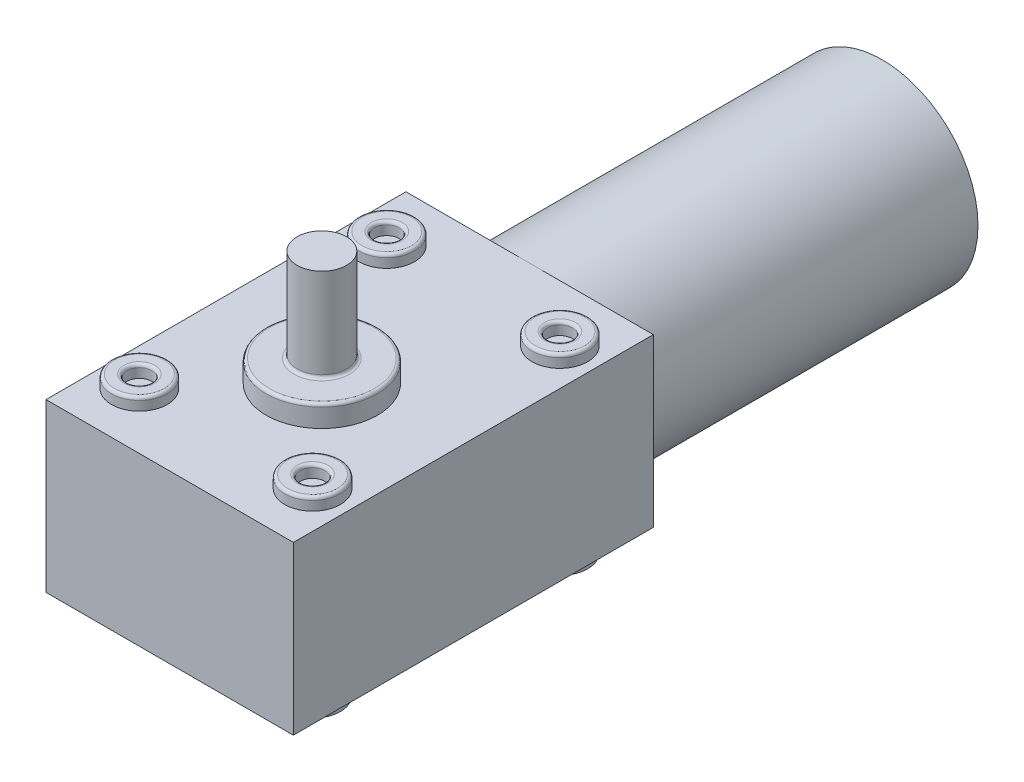
ISO-10303-21;
HEADER;
FILE_DESCRIPTION(('STEP AP214'),'2;1');
FILE_NAME('part.step','',(''),(''),'','','');
FILE_SCHEMA(('AUTOMOTIVE_DESIGN { 1 0 10303 214 1 1 1 1 }'));
ENDSEC;
DATA;
#1=APPLICATION_CONTEXT('core data for automotive mechanical design processes');
#2=APPLICATION_PROTOCOL_DEFINITION('international standard','automotive_design',2000,#1);
#3=PRODUCT_CONTEXT('',#1,'mechanical');
#4=PRODUCT('Part','Part','',(#3));
#5=PRODUCT_RELATED_PRODUCT_CATEGORY('part','',(#4));
#6=PRODUCT_DEFINITION_FORMATION('','',#4);
#7=PRODUCT_DEFINITION_CONTEXT('part definition',#1,'design');
#8=PRODUCT_DEFINITION('design','',#6,#7);
#9=PRODUCT_DEFINITION_SHAPE('','',#8);
#10=(LENGTH_UNIT() NAMED_UNIT(*) SI_UNIT(.MILLI.,.METRE.));
#11=(NAMED_UNIT(*) PLANE_ANGLE_UNIT() SI_UNIT($,.RADIAN.));
#12=(NAMED_UNIT(*) SI_UNIT($,.STERADIAN.) SOLID_ANGLE_UNIT());
#13=UNCERTAINTY_MEASURE_WITH_UNIT(LENGTH_MEASURE(1.E-05),#10,'distance_accuracy_value','');
#14=(GEOMETRIC_REPRESENTATION_CONTEXT(3) GLOBAL_UNCERTAINTY_ASSIGNED_CONTEXT((#13)) GLOBAL_UNIT_ASSIGNED_CONTEXT((#10,
#11,#12)) REPRESENTATION_CONTEXT('',''));
#15=CARTESIAN_POINT('',(0.,0.,0.));
#16=DIRECTION('',(0.,0.,1.));
#17=DIRECTION('',(1.,0.,0.));
#18=AXIS2_PLACEMENT_3D('',#15,#16,#17);
#19=CARTESIAN_POINT('',(0.,0.,0.));
#20=DIRECTION('',(0.,0.,-1.));
#21=DIRECTION('',(-1.,0.,0.));
#22=AXIS2_PLACEMENT_3D('',#19,#20,#21);
#23=PLANE('',#22);
#24=DIRECTION('',(-1.,0.,0.));
#25=VECTOR('',#24,1.);
#26=CARTESIAN_POINT('',(-20.,13.5,0.));
#27=LINE('',#26,#25);
#28=CARTESIAN_POINT('',(0.,13.5,0.));
#29=VERTEX_POINT('',#28);
#30=CARTESIAN_POINT('',(-20.,13.5,0.));
#31=VERTEX_POINT('',#30);
#32=EDGE_CURVE('E120',#29,#31,#27,.T.);
#33=ORIENTED_EDGE('',*,*,#32,.F.);
#34=CARTESIAN_POINT('',(0.,-2.,0.));
#35=DIRECTION('',(0.,0.,1.));
#36=DIRECTION('',(1.,0.,0.));
#37=AXIS2_PLACEMENT_3D('',#34,#35,#36);
#38=CIRCLE('',#37,15.5);
#39=CARTESIAN_POINT('',(-10.3923048454133,-13.5,0.));
#40=VERTEX_POINT('',#39);
#41=EDGE_CURVE('E59',#29,#40,#38,.T.);
#42=ORIENTED_EDGE('',*,*,#41,.T.);
#43=DIRECTION('',(1.,0.,0.));
#44=VECTOR('',#43,1.);
#45=CARTESIAN_POINT('',(-20.,-13.5,0.));
#46=LINE('',#45,#44);
#47=CARTESIAN_POINT('',(-20.,-13.5,0.));
#48=VERTEX_POINT('',#47);
#49=EDGE_CURVE('E109',#48,#40,#46,.T.);
#50=ORIENTED_EDGE('',*,*,#49,.F.);
#51=DIRECTION('',(0.,-1.,0.));
#52=VECTOR('',#51,1.);
#53=CARTESIAN_POINT('',(-20.,-13.5,0.));
#54=LINE('',#53,#52);
#55=EDGE_CURVE('E135',#31,#48,#54,.T.);
#56=ORIENTED_EDGE('',*,*,#55,.F.);
#57=EDGE_LOOP('',(#33,#42,#50,#56));
#58=FACE_BOUND('',#57,.T.);
#59=ADVANCED_FACE('F43',(#58),#23,.T.);
#60=CARTESIAN_POINT('',(20.,-13.5,58.2));
#61=DIRECTION('',(-1.,0.,0.));
#62=DIRECTION('',(0.,0.,1.));
#63=AXIS2_PLACEMENT_3D('',#60,#61,#62);
#64=PLANE('',#63);
#65=DIRECTION('',(0.,1.,0.));
#66=VECTOR('',#65,1.);
#67=CARTESIAN_POINT('',(20.,-13.5,0.));
#68=LINE('',#67,#66);
#69=CARTESIAN_POINT('',(20.,-13.5,0.));
#70=VERTEX_POINT('',#69);
#71=CARTESIAN_POINT('',(20.,13.5,0.));
#72=VERTEX_POINT('',#71);
#73=EDGE_CURVE('E143',#70,#72,#68,.T.);
#74=ORIENTED_EDGE('',*,*,#73,.T.);
#75=DIRECTION('',(0.,0.,-1.));
#76=VECTOR('',#75,1.);
#77=CARTESIAN_POINT('',(20.,13.5,58.2));
#78=LINE('',#77,#76);
#79=CARTESIAN_POINT('',(20.,13.5,58.2));
#80=VERTEX_POINT('',#79);
#81=EDGE_CURVE('E270',#80,#72,#78,.T.);
#82=ORIENTED_EDGE('',*,*,#81,.F.);
#83=DIRECTION('',(0.,1.,0.));
#84=VECTOR('',#83,1.);
#85=CARTESIAN_POINT('',(20.,-13.5,58.2));
#86=LINE('',#85,#84);
#87=CARTESIAN_POINT('',(20.,-13.5,58.2));
#88=VERTEX_POINT('',#87);
#89=EDGE_CURVE('E129',#88,#80,#86,.T.);
#90=ORIENTED_EDGE('',*,*,#89,.F.);
#91=DIRECTION('',(0.,0.,-1.));
#92=VECTOR('',#91,1.);
#93=CARTESIAN_POINT('',(20.,-13.5,58.2));
#94=LINE('',#93,#92);
#95=EDGE_CURVE('E149',#88,#70,#94,.T.);
#96=ORIENTED_EDGE('',*,*,#95,.T.);
#97=EDGE_LOOP('',(#74,#82,#90,#96));
#98=FACE_BOUND('',#97,.T.);
#99=ADVANCED_FACE('F246',(#98),#64,.F.);
#100=CARTESIAN_POINT('',(-20.,13.5,58.2));
#101=DIRECTION('',(0.,-1.,0.));
#102=DIRECTION('',(0.,0.,-1.));
#103=AXIS2_PLACEMENT_3D('',#100,#101,#102);
#104=PLANE('',#103);
#105=CARTESIAN_POINT('',(0.,13.5,33.6));
#106=DIRECTION('',(0.,-1.,0.));
#107=DIRECTION('',(0.,0.,-1.));
#108=AXIS2_PLACEMENT_3D('',#105,#106,#107);
#109=CIRCLE('',#108,9.);
#110=CARTESIAN_POINT('',(0.,13.5,24.6));
#111=VERTEX_POINT('',#110);
#112=EDGE_CURVE('E296',#111,#111,#109,.F.);
#113=ORIENTED_EDGE('',*,*,#112,.F.);
#114=EDGE_LOOP('',(#113));
#115=FACE_BOUND('',#114,.T.);
#116=CARTESIAN_POINT('',(-14.,13.5,49.1));
#117=DIRECTION('',(0.,-1.,0.));
#118=DIRECTION('',(0.,0.,-1.));
#119=AXIS2_PLACEMENT_3D('',#116,#117,#118);
#120=CIRCLE('',#119,4.5);
#121=CARTESIAN_POINT('',(-14.,13.5,44.6));
#122=VERTEX_POINT('',#121);
#123=EDGE_CURVE('E292',#122,#122,#120,.F.);
#124=ORIENTED_EDGE('',*,*,#123,.F.);
#125=EDGE_LOOP('',(#124));
#126=FACE_BOUND('',#125,.T.);
#127=CARTESIAN_POINT('',(14.,13.5,49.1));
#128=DIRECTION('',(0.,-1.,0.));
#129=DIRECTION('',(0.,0.,-1.));
#130=AXIS2_PLACEMENT_3D('',#127,#128,#129);
#131=CIRCLE('',#130,4.5);
#132=CARTESIAN_POINT('',(14.,13.5,44.6));
#133=VERTEX_POINT('',#132);
#134=EDGE_CURVE('E288',#133,#133,#131,.F.);
#135=ORIENTED_EDGE('',*,*,#134,.F.);
#136=EDGE_LOOP('',(#135));
#137=FACE_BOUND('',#136,.T.);
#138=CARTESIAN_POINT('',(-14.,13.5,9.1));
#139=DIRECTION('',(0.,-1.,0.));
#140=DIRECTION('',(0.,0.,-1.));
#141=AXIS2_PLACEMENT_3D('',#138,#139,#140);
#142=CIRCLE('',#141,4.5);
#143=CARTESIAN_POINT('',(-14.,13.5,4.6));
#144=VERTEX_POINT('',#143);
#145=EDGE_CURVE('E284',#144,#144,#142,.F.);
#146=ORIENTED_EDGE('',*,*,#145,.F.);
#147=EDGE_LOOP('',(#146));
#148=FACE_BOUND('',#147,.T.);
#149=CARTESIAN_POINT('',(14.,13.5,9.1));
#150=DIRECTION('',(0.,-1.,0.));
#151=DIRECTION('',(0.,0.,-1.));
#152=AXIS2_PLACEMENT_3D('',#149,#150,#151);
#153=CIRCLE('',#152,4.50000000000001);
#154=CARTESIAN_POINT('',(14.,13.5,4.59999999999999));
#155=VERTEX_POINT('',#154);
#156=EDGE_CURVE('E280',#155,#155,#153,.F.);
#157=ORIENTED_EDGE('',*,*,#156,.F.);
#158=EDGE_LOOP('',(#157));
#159=FACE_BOUND('',#158,.T.);
#160=EDGE_CURVE('E137',#72,#29,#27,.T.);
#161=ORIENTED_EDGE('',*,*,#160,.T.);
#162=ORIENTED_EDGE('',*,*,#32,.T.);
#163=DIRECTION('',(0.,0.,-1.));
#164=VECTOR('',#163,1.);
#165=CARTESIAN_POINT('',(-20.,13.5,58.2));
#166=LINE('',#165,#164);
#167=CARTESIAN_POINT('',(-20.,13.5,58.2));
#168=VERTEX_POINT('',#167);
#169=EDGE_CURVE('E273',#168,#31,#166,.T.);
#170=ORIENTED_EDGE('',*,*,#169,.F.);
#171=DIRECTION('',(-1.,0.,0.));
#172=VECTOR('',#171,1.);
#173=CARTESIAN_POINT('',(-20.,13.5,58.2));
#174=LINE('',#173,#172);
#175=EDGE_CURVE('E97',#80,#168,#174,.T.);
#176=ORIENTED_EDGE('',*,*,#175,.F.);
#177=ORIENTED_EDGE('',*,*,#81,.T.);
#178=EDGE_LOOP('',(#161,#162,#170,#176,#177));
#179=FACE_BOUND('',#178,.T.);
#180=ADVANCED_FACE('F254',(#115,#126,#137,#148,#159,#179),#104,.F.);
#181=CARTESIAN_POINT('',(-20.,-13.5,58.2));
#182=DIRECTION('',(1.,0.,0.));
#183=DIRECTION('',(0.,0.,-1.));
#184=AXIS2_PLACEMENT_3D('',#181,#182,#183);
#185=PLANE('',#184);
#186=ORIENTED_EDGE('',*,*,#55,.T.);
#187=DIRECTION('',(0.,0.,-1.));
#188=VECTOR('',#187,1.);
#189=CARTESIAN_POINT('',(-20.,-13.5,58.2));
#190=LINE('',#189,#188);
#191=CARTESIAN_POINT('',(-20.,-13.5,58.2));
#192=VERTEX_POINT('',#191);
#193=EDGE_CURVE('E127',#192,#48,#190,.T.);
#194=ORIENTED_EDGE('',*,*,#193,.F.);
#195=DIRECTION('',(0.,-1.,0.));
#196=VECTOR('',#195,1.);
#197=CARTESIAN_POINT('',(-20.,-13.5,58.2));
#198=LINE('',#197,#196);
#199=EDGE_CURVE('E150',#168,#192,#198,.T.);
#200=ORIENTED_EDGE('',*,*,#199,.F.);
#201=ORIENTED_EDGE('',*,*,#169,.T.);
#202=EDGE_LOOP('',(#186,#194,#200,#201));
#203=FACE_BOUND('',#202,.T.);
#204=ADVANCED_FACE('F427',(#203),#185,.F.);
#205=CARTESIAN_POINT('',(-20.,-13.5,58.2));
#206=DIRECTION('',(0.,1.,0.));
#207=DIRECTION('',(0.,0.,1.));
#208=AXIS2_PLACEMENT_3D('',#205,#206,#207);
#209=PLANE('',#208);
#210=CARTESIAN_POINT('',(0.,-13.5,33.6));
#211=DIRECTION('',(0.,1.,0.));
#212=DIRECTION('',(0.,0.,1.));
#213=AXIS2_PLACEMENT_3D('',#210,#211,#212);
#214=CIRCLE('',#213,9.);
#215=CARTESIAN_POINT('',(0.,-13.5,42.6));
#216=VERTEX_POINT('',#215);
#217=EDGE_CURVE('E226',#216,#216,#214,.T.);
#218=ORIENTED_EDGE('',*,*,#217,.T.);
#219=EDGE_LOOP('',(#218));
#220=FACE_BOUND('',#219,.T.);
#221=CARTESIAN_POINT('',(-14.,-13.5,49.1));
#222=DIRECTION('',(0.,1.,0.));
#223=DIRECTION('',(0.,0.,1.));
#224=AXIS2_PLACEMENT_3D('',#221,#222,#223);
#225=CIRCLE('',#224,4.5);
#226=CARTESIAN_POINT('',(-14.,-13.5,53.6));
#227=VERTEX_POINT('',#226);
#228=EDGE_CURVE('E214',#227,#227,#225,.T.);
#229=ORIENTED_EDGE('',*,*,#228,.T.);
#230=EDGE_LOOP('',(#229));
#231=FACE_BOUND('',#230,.T.);
#232=CARTESIAN_POINT('',(14.,-13.5,49.1));
#233=DIRECTION('',(0.,1.,0.));
#234=DIRECTION('',(0.,0.,1.));
#235=AXIS2_PLACEMENT_3D('',#232,#233,#234);
#236=CIRCLE('',#235,4.5);
#237=CARTESIAN_POINT('',(14.,-13.5,53.6));
#238=VERTEX_POINT('',#237);
#239=EDGE_CURVE('E202',#238,#238,#236,.T.);
#240=ORIENTED_EDGE('',*,*,#239,.T.);
#241=EDGE_LOOP('',(#240));
#242=FACE_BOUND('',#241,.T.);
#243=CARTESIAN_POINT('',(-14.,-13.5,9.1));
#244=DIRECTION('',(0.,1.,0.));
#245=DIRECTION('',(0.,0.,1.));
#246=AXIS2_PLACEMENT_3D('',#243,#244,#245);
#247=CIRCLE('',#246,4.5);
#248=CARTESIAN_POINT('',(-14.,-13.5,13.6));
#249=VERTEX_POINT('',#248);
#250=EDGE_CURVE('E190',#249,#249,#247,.T.);
#251=ORIENTED_EDGE('',*,*,#250,.T.);
#252=EDGE_LOOP('',(#251));
#253=FACE_BOUND('',#252,.T.);
#254=CARTESIAN_POINT('',(14.,-13.5,9.1));
#255=DIRECTION('',(0.,1.,0.));
#256=DIRECTION('',(0.,0.,1.));
#257=AXIS2_PLACEMENT_3D('',#254,#255,#256);
#258=CIRCLE('',#257,4.50000000000001);
#259=CARTESIAN_POINT('',(14.,-13.5,13.6));
#260=VERTEX_POINT('',#259);
#261=EDGE_CURVE('E178',#260,#260,#258,.T.);
#262=ORIENTED_EDGE('',*,*,#261,.T.);
#263=EDGE_LOOP('',(#262));
#264=FACE_BOUND('',#263,.T.);
#265=ORIENTED_EDGE('',*,*,#49,.T.);
#266=CARTESIAN_POINT('',(10.3923048454133,-13.5,0.));
#267=VERTEX_POINT('',#266);
#268=EDGE_CURVE('E104',#40,#267,#46,.T.);
#269=ORIENTED_EDGE('',*,*,#268,.T.);
#270=EDGE_CURVE('E89',#267,#70,#46,.T.);
#271=ORIENTED_EDGE('',*,*,#270,.T.);
#272=ORIENTED_EDGE('',*,*,#95,.F.);
#273=DIRECTION('',(1.,0.,0.));
#274=VECTOR('',#273,1.);
#275=CARTESIAN_POINT('',(-20.,-13.5,58.2));
#276=LINE('',#275,#274);
#277=EDGE_CURVE('E68',#192,#88,#276,.T.);
#278=ORIENTED_EDGE('',*,*,#277,.F.);
#279=ORIENTED_EDGE('',*,*,#193,.T.);
#280=EDGE_LOOP('',(#265,#269,#271,#272,#278,#279));
#281=FACE_BOUND('',#280,.T.);
#282=ADVANCED_FACE('F125',(#220,#231,#242,#253,#264,#281),#209,.F.);
#283=CARTESIAN_POINT('',(0.,0.,58.2));
#284=DIRECTION('',(0.,0.,-1.));
#285=DIRECTION('',(-1.,0.,0.));
#286=AXIS2_PLACEMENT_3D('',#283,#284,#285);
#287=PLANE('',#286);
#288=ORIENTED_EDGE('',*,*,#89,.T.);
#289=ORIENTED_EDGE('',*,*,#175,.T.);
#290=ORIENTED_EDGE('',*,*,#199,.T.);
#291=ORIENTED_EDGE('',*,*,#277,.T.);
#292=EDGE_LOOP('',(#288,#289,#290,#291));
#293=FACE_BOUND('',#292,.T.);
#294=ADVANCED_FACE('F259',(#293),#287,.F.);
#295=ORIENTED_EDGE('',*,*,#270,.F.);
#296=EDGE_CURVE('E112',#267,#29,#38,.T.);
#297=ORIENTED_EDGE('',*,*,#296,.T.);
#298=ORIENTED_EDGE('',*,*,#160,.F.);
#299=ORIENTED_EDGE('',*,*,#73,.F.);
#300=EDGE_LOOP('',(#295,#297,#298,#299));
#301=FACE_BOUND('',#300,.T.);
#302=ADVANCED_FACE('F248',(#301),#23,.T.);
#303=CARTESIAN_POINT('',(0.,-2.,0.));
#304=DIRECTION('',(0.,0.,1.));
#305=DIRECTION('',(1.,0.,0.));
#306=AXIS2_PLACEMENT_3D('',#303,#304,#305);
#307=PLANE('',#306);
#308=ORIENTED_EDGE('',*,*,#268,.F.);
#309=EDGE_CURVE('E106',#40,#267,#38,.T.);
#310=ORIENTED_EDGE('',*,*,#309,.T.);
#311=EDGE_LOOP('',(#308,#310));
#312=FACE_BOUND('',#311,.T.);
#313=ADVANCED_FACE('F105',(#312),#307,.T.);
#314=CARTESIAN_POINT('',(0.,-2.,-57.));
#315=DIRECTION('',(0.,0.,1.));
#316=DIRECTION('',(1.,0.,0.));
#317=AXIS2_PLACEMENT_3D('',#314,#315,#316);
#318=CYLINDRICAL_SURFACE('',#317,15.5);
#319=CARTESIAN_POINT('',(0.,-2.,-57.));
#320=DIRECTION('',(0.,0.,1.));
#321=DIRECTION('',(1.,0.,0.));
#322=AXIS2_PLACEMENT_3D('',#319,#320,#321);
#323=CIRCLE('',#322,15.5);
#324=CARTESIAN_POINT('',(15.5,-2.,-57.));
#325=VERTEX_POINT('',#324);
#326=EDGE_CURVE('E123',#325,#325,#323,.T.);
#327=ORIENTED_EDGE('',*,*,#326,.T.);
#328=EDGE_LOOP('',(#327));
#329=FACE_BOUND('',#328,.T.);
#330=ORIENTED_EDGE('',*,*,#41,.F.);
#331=ORIENTED_EDGE('',*,*,#296,.F.);
#332=ORIENTED_EDGE('',*,*,#309,.F.);
#333=EDGE_LOOP('',(#330,#331,#332));
#334=FACE_BOUND('',#333,.T.);
#335=ADVANCED_FACE('F111',(#329,#334),#318,.T.);
#336=CARTESIAN_POINT('',(0.,-2.,-57.));
#337=DIRECTION('',(0.,0.,1.));
#338=DIRECTION('',(1.,0.,0.));
#339=AXIS2_PLACEMENT_3D('',#336,#337,#338);
#340=PLANE('',#339);
#341=ORIENTED_EDGE('',*,*,#326,.F.);
#342=EDGE_LOOP('',(#341));
#343=FACE_BOUND('',#342,.T.);
#344=ADVANCED_FACE('F529',(#343),#340,.F.);
#345=CARTESIAN_POINT('',(14.,15.5,9.1));
#346=DIRECTION('',(0.,1.,0.));
#347=DIRECTION('',(0.,0.,1.));
#348=AXIS2_PLACEMENT_3D('',#345,#346,#347);
#349=PLANE('',#348);
#350=CARTESIAN_POINT('',(14.,15.5,9.1));
#351=DIRECTION('',(0.,1.,0.));
#352=DIRECTION('',(0.,0.,1.));
#353=AXIS2_PLACEMENT_3D('',#350,#351,#352);
#354=CIRCLE('',#353,2.5);
#355=CARTESIAN_POINT('',(14.,15.5,11.6));
#356=VERTEX_POINT('',#355);
#357=EDGE_CURVE('E372',#356,#356,#354,.F.);
#358=ORIENTED_EDGE('',*,*,#357,.T.);
#359=EDGE_LOOP('',(#358));
#360=FACE_BOUND('',#359,.T.);
#361=CARTESIAN_POINT('',(14.,15.5,9.1));
#362=DIRECTION('',(0.,1.,0.));
#363=DIRECTION('',(0.,0.,1.));
#364=AXIS2_PLACEMENT_3D('',#361,#362,#363);
#365=CIRCLE('',#364,4.00000000000001);
#366=CARTESIAN_POINT('',(14.,15.5,13.1));
#367=VERTEX_POINT('',#366);
#368=EDGE_CURVE('E368',#367,#367,#365,.T.);
#369=ORIENTED_EDGE('',*,*,#368,.T.);
#370=EDGE_LOOP('',(#369));
#371=FACE_BOUND('',#370,.T.);
#372=ADVANCED_FACE('F526',(#360,#371),#349,.T.);
#373=CARTESIAN_POINT('',(14.,15.5,9.1));
#374=DIRECTION('',(0.,-1.,0.));
#375=DIRECTION('',(0.,0.,-1.));
#376=AXIS2_PLACEMENT_3D('',#373,#374,#375);
#377=CYLINDRICAL_SURFACE('',#376,4.50000000000001);
#378=CARTESIAN_POINT('',(14.,15.,9.1));
#379=DIRECTION('',(0.,1.,0.));
#380=DIRECTION('',(0.,0.,1.));
#381=AXIS2_PLACEMENT_3D('',#378,#379,#380);
#382=CIRCLE('',#381,4.50000000000001);
#383=CARTESIAN_POINT('',(14.,15.,13.6));
#384=VERTEX_POINT('',#383);
#385=EDGE_CURVE('E376',#384,#384,#382,.F.);
#386=ORIENTED_EDGE('',*,*,#385,.T.);
#387=EDGE_LOOP('',(#386));
#388=FACE_BOUND('',#387,.T.);
#389=ORIENTED_EDGE('',*,*,#156,.T.);
#390=EDGE_LOOP('',(#389));
#391=FACE_BOUND('',#390,.T.);
#392=ADVANCED_FACE('F524',(#388,#391),#377,.T.);
#393=CARTESIAN_POINT('',(14.,15.5,9.1));
#394=DIRECTION('',(0.,-1.,0.));
#395=DIRECTION('',(0.,0.,-1.));
#396=AXIS2_PLACEMENT_3D('',#393,#394,#395);
#397=CYLINDRICAL_SURFACE('',#396,2.);
#398=CARTESIAN_POINT('',(14.,15.,9.1));
#399=DIRECTION('',(0.,1.,0.));
#400=DIRECTION('',(0.,0.,1.));
#401=AXIS2_PLACEMENT_3D('',#398,#399,#400);
#402=CIRCLE('',#401,2.);
#403=CARTESIAN_POINT('',(14.,15.,11.1));
#404=VERTEX_POINT('',#403);
#405=EDGE_CURVE('E364',#404,#404,#402,.T.);
#406=ORIENTED_EDGE('',*,*,#405,.T.);
#407=EDGE_LOOP('',(#406));
#408=FACE_BOUND('',#407,.T.);
#409=CARTESIAN_POINT('',(14.,13.5,9.1));
#410=DIRECTION('',(0.,1.,0.));
#411=DIRECTION('',(0.,0.,1.));
#412=AXIS2_PLACEMENT_3D('',#409,#410,#411);
#413=CIRCLE('',#412,2.);
#414=CARTESIAN_POINT('',(14.,13.5,11.1));
#415=VERTEX_POINT('',#414);
#416=EDGE_CURVE('E114',#415,#415,#413,.T.);
#417=ORIENTED_EDGE('',*,*,#416,.F.);
#418=EDGE_LOOP('',(#417));
#419=FACE_BOUND('',#418,.T.);
#420=ADVANCED_FACE('F521',(#408,#419),#397,.F.);
#421=ORIENTED_EDGE('',*,*,#416,.T.);
#422=EDGE_LOOP('',(#421));
#423=FACE_BOUND('',#422,.T.);
#424=ADVANCED_FACE('F516',(#423),#104,.F.);
#425=CARTESIAN_POINT('',(-14.,15.5,9.1));
#426=DIRECTION('',(0.,1.,0.));
#427=DIRECTION('',(0.,0.,1.));
#428=AXIS2_PLACEMENT_3D('',#425,#426,#427);
#429=PLANE('',#428);
#430=CARTESIAN_POINT('',(-14.,15.5,9.1));
#431=DIRECTION('',(0.,1.,0.));
#432=DIRECTION('',(0.,0.,1.));
#433=AXIS2_PLACEMENT_3D('',#430,#431,#432);
#434=CIRCLE('',#433,2.5);
#435=CARTESIAN_POINT('',(-14.,15.5,11.6));
#436=VERTEX_POINT('',#435);
#437=EDGE_CURVE('E356',#436,#436,#434,.F.);
#438=ORIENTED_EDGE('',*,*,#437,.T.);
#439=EDGE_LOOP('',(#438));
#440=FACE_BOUND('',#439,.T.);
#441=CARTESIAN_POINT('',(-14.,15.5,9.1));
#442=DIRECTION('',(0.,1.,0.));
#443=DIRECTION('',(0.,0.,1.));
#444=AXIS2_PLACEMENT_3D('',#441,#442,#443);
#445=CIRCLE('',#444,4.);
#446=CARTESIAN_POINT('',(-14.,15.5,13.1));
#447=VERTEX_POINT('',#446);
#448=EDGE_CURVE('E352',#447,#447,#445,.T.);
#449=ORIENTED_EDGE('',*,*,#448,.T.);
#450=EDGE_LOOP('',(#449));
#451=FACE_BOUND('',#450,.T.);
#452=ADVANCED_FACE('F512',(#440,#451),#429,.T.);
#453=CARTESIAN_POINT('',(-14.,15.5,9.1));
#454=DIRECTION('',(0.,-1.,0.));
#455=DIRECTION('',(0.,0.,-1.));
#456=AXIS2_PLACEMENT_3D('',#453,#454,#455);
#457=CYLINDRICAL_SURFACE('',#456,4.5);
#458=CARTESIAN_POINT('',(-14.,15.,9.1));
#459=DIRECTION('',(0.,1.,0.));
#460=DIRECTION('',(0.,0.,1.));
#461=AXIS2_PLACEMENT_3D('',#458,#459,#460);
#462=CIRCLE('',#461,4.5);
#463=CARTESIAN_POINT('',(-14.,15.,13.6));
#464=VERTEX_POINT('',#463);
#465=EDGE_CURVE('E360',#464,#464,#462,.F.);
#466=ORIENTED_EDGE('',*,*,#465,.T.);
#467=EDGE_LOOP('',(#466));
#468=FACE_BOUND('',#467,.T.);
#469=ORIENTED_EDGE('',*,*,#145,.T.);
#470=EDGE_LOOP('',(#469));
#471=FACE_BOUND('',#470,.T.);
#472=ADVANCED_FACE('F508',(#468,#471),#457,.T.);
#473=CARTESIAN_POINT('',(-14.,15.5,9.1));
#474=DIRECTION('',(0.,-1.,0.));
#475=DIRECTION('',(0.,0.,-1.));
#476=AXIS2_PLACEMENT_3D('',#473,#474,#475);
#477=CYLINDRICAL_SURFACE('',#476,2.);
#478=CARTESIAN_POINT('',(-14.,15.,9.1));
#479=DIRECTION('',(0.,1.,0.));
#480=DIRECTION('',(0.,0.,1.));
#481=AXIS2_PLACEMENT_3D('',#478,#479,#480);
#482=CIRCLE('',#481,2.);
#483=CARTESIAN_POINT('',(-14.,15.,11.1));
#484=VERTEX_POINT('',#483);
#485=EDGE_CURVE('E348',#484,#484,#482,.T.);
#486=ORIENTED_EDGE('',*,*,#485,.T.);
#487=EDGE_LOOP('',(#486));
#488=FACE_BOUND('',#487,.T.);
#489=CARTESIAN_POINT('',(-14.,13.5,9.1));
#490=DIRECTION('',(0.,1.,0.));
#491=DIRECTION('',(0.,0.,1.));
#492=AXIS2_PLACEMENT_3D('',#489,#490,#491);
#493=CIRCLE('',#492,2.);
#494=CARTESIAN_POINT('',(-14.,13.5,11.1));
#495=VERTEX_POINT('',#494);
#496=EDGE_CURVE('E161',#495,#495,#493,.T.);
#497=ORIENTED_EDGE('',*,*,#496,.F.);
#498=EDGE_LOOP('',(#497));
#499=FACE_BOUND('',#498,.T.);
#500=ADVANCED_FACE('F511',(#488,#499),#477,.F.);
#501=ORIENTED_EDGE('',*,*,#496,.T.);
#502=EDGE_LOOP('',(#501));
#503=FACE_BOUND('',#502,.T.);
#504=ADVANCED_FACE('F503',(#503),#104,.F.);
#505=CARTESIAN_POINT('',(14.,15.5,49.1));
#506=DIRECTION('',(0.,1.,0.));
#507=DIRECTION('',(0.,0.,1.));
#508=AXIS2_PLACEMENT_3D('',#505,#506,#507);
#509=PLANE('',#508);
#510=CARTESIAN_POINT('',(14.,15.5,49.1));
#511=DIRECTION('',(0.,1.,0.));
#512=DIRECTION('',(0.,0.,1.));
#513=AXIS2_PLACEMENT_3D('',#510,#511,#512);
#514=CIRCLE('',#513,2.5);
#515=CARTESIAN_POINT('',(14.,15.5,51.6));
#516=VERTEX_POINT('',#515);
#517=EDGE_CURVE('E340',#516,#516,#514,.F.);
#518=ORIENTED_EDGE('',*,*,#517,.T.);
#519=EDGE_LOOP('',(#518));
#520=FACE_BOUND('',#519,.T.);
#521=CARTESIAN_POINT('',(14.,15.5,49.1));
#522=DIRECTION('',(0.,1.,0.));
#523=DIRECTION('',(0.,0.,1.));
#524=AXIS2_PLACEMENT_3D('',#521,#522,#523);
#525=CIRCLE('',#524,4.);
#526=CARTESIAN_POINT('',(14.,15.5,53.1));
#527=VERTEX_POINT('',#526);
#528=EDGE_CURVE('E336',#527,#527,#525,.T.);
#529=ORIENTED_EDGE('',*,*,#528,.T.);
#530=EDGE_LOOP('',(#529));
#531=FACE_BOUND('',#530,.T.);
#532=ADVANCED_FACE('F499',(#520,#531),#509,.T.);
#533=CARTESIAN_POINT('',(14.,15.5,49.1));
#534=DIRECTION('',(0.,-1.,0.));
#535=DIRECTION('',(0.,0.,-1.));
#536=AXIS2_PLACEMENT_3D('',#533,#534,#535);
#537=CYLINDRICAL_SURFACE('',#536,4.5);
#538=CARTESIAN_POINT('',(14.,15.,49.1));
#539=DIRECTION('',(0.,1.,0.));
#540=DIRECTION('',(0.,0.,1.));
#541=AXIS2_PLACEMENT_3D('',#538,#539,#540);
#542=CIRCLE('',#541,4.5);
#543=CARTESIAN_POINT('',(14.,15.,53.6));
#544=VERTEX_POINT('',#543);
#545=EDGE_CURVE('E344',#544,#544,#542,.F.);
#546=ORIENTED_EDGE('',*,*,#545,.T.);
#547=EDGE_LOOP('',(#546));
#548=FACE_BOUND('',#547,.T.);
#549=ORIENTED_EDGE('',*,*,#134,.T.);
#550=EDGE_LOOP('',(#549));
#551=FACE_BOUND('',#550,.T.);
#552=ADVANCED_FACE('F495',(#548,#551),#537,.T.);
#553=CARTESIAN_POINT('',(14.,15.5,49.1));
#554=DIRECTION('',(0.,-1.,0.));
#555=DIRECTION('',(0.,0.,-1.));
#556=AXIS2_PLACEMENT_3D('',#553,#554,#555);
#557=CYLINDRICAL_SURFACE('',#556,2.);
#558=CARTESIAN_POINT('',(14.,15.,49.1));
#559=DIRECTION('',(0.,1.,0.));
#560=DIRECTION('',(0.,0.,1.));
#561=AXIS2_PLACEMENT_3D('',#558,#559,#560);
#562=CIRCLE('',#561,2.);
#563=CARTESIAN_POINT('',(14.,15.,51.1));
#564=VERTEX_POINT('',#563);
#565=EDGE_CURVE('E332',#564,#564,#562,.T.);
#566=ORIENTED_EDGE('',*,*,#565,.T.);
#567=EDGE_LOOP('',(#566));
#568=FACE_BOUND('',#567,.T.);
#569=CARTESIAN_POINT('',(14.,13.5,49.1));
#570=DIRECTION('',(0.,1.,0.));
#571=DIRECTION('',(0.,0.,1.));
#572=AXIS2_PLACEMENT_3D('',#569,#570,#571);
#573=CIRCLE('',#572,2.);
#574=CARTESIAN_POINT('',(14.,13.5,51.1));
#575=VERTEX_POINT('',#574);
#576=EDGE_CURVE('E165',#575,#575,#573,.T.);
#577=ORIENTED_EDGE('',*,*,#576,.F.);
#578=EDGE_LOOP('',(#577));
#579=FACE_BOUND('',#578,.T.);
#580=ADVANCED_FACE('F498',(#568,#579),#557,.F.);
#581=ORIENTED_EDGE('',*,*,#576,.T.);
#582=EDGE_LOOP('',(#581));
#583=FACE_BOUND('',#582,.T.);
#584=ADVANCED_FACE('F490',(#583),#104,.F.);
#585=CARTESIAN_POINT('',(-14.,15.5,49.1));
#586=DIRECTION('',(0.,1.,0.));
#587=DIRECTION('',(0.,0.,1.));
#588=AXIS2_PLACEMENT_3D('',#585,#586,#587);
#589=PLANE('',#588);
#590=CARTESIAN_POINT('',(-14.,15.5,49.1));
#591=DIRECTION('',(0.,1.,0.));
#592=DIRECTION('',(0.,0.,1.));
#593=AXIS2_PLACEMENT_3D('',#590,#591,#592);
#594=CIRCLE('',#593,2.5);
#595=CARTESIAN_POINT('',(-14.,15.5,51.6));
#596=VERTEX_POINT('',#595);
#597=EDGE_CURVE('E324',#596,#596,#594,.F.);
#598=ORIENTED_EDGE('',*,*,#597,.T.);
#599=EDGE_LOOP('',(#598));
#600=FACE_BOUND('',#599,.T.);
#601=CARTESIAN_POINT('',(-14.,15.5,49.1));
#602=DIRECTION('',(0.,1.,0.));
#603=DIRECTION('',(0.,0.,1.));
#604=AXIS2_PLACEMENT_3D('',#601,#602,#603);
#605=CIRCLE('',#604,4.);
#606=CARTESIAN_POINT('',(-14.,15.5,53.1));
#607=VERTEX_POINT('',#606);
#608=EDGE_CURVE('E320',#607,#607,#605,.T.);
#609=ORIENTED_EDGE('',*,*,#608,.T.);
#610=EDGE_LOOP('',(#609));
#611=FACE_BOUND('',#610,.T.);
#612=ADVANCED_FACE('F486',(#600,#611),#589,.T.);
#613=CARTESIAN_POINT('',(-14.,15.5,49.1));
#614=DIRECTION('',(0.,-1.,0.));
#615=DIRECTION('',(0.,0.,-1.));
#616=AXIS2_PLACEMENT_3D('',#613,#614,#615);
#617=CYLINDRICAL_SURFACE('',#616,4.5);
#618=CARTESIAN_POINT('',(-14.,15.,49.1));
#619=DIRECTION('',(0.,1.,0.));
#620=DIRECTION('',(0.,0.,1.));
#621=AXIS2_PLACEMENT_3D('',#618,#619,#620);
#622=CIRCLE('',#621,4.5);
#623=CARTESIAN_POINT('',(-14.,15.,53.6));
#624=VERTEX_POINT('',#623);
#625=EDGE_CURVE('E328',#624,#624,#622,.F.);
#626=ORIENTED_EDGE('',*,*,#625,.T.);
#627=EDGE_LOOP('',(#626));
#628=FACE_BOUND('',#627,.T.);
#629=ORIENTED_EDGE('',*,*,#123,.T.);
#630=EDGE_LOOP('',(#629));
#631=FACE_BOUND('',#630,.T.);
#632=ADVANCED_FACE('F482',(#628,#631),#617,.T.);
#633=CARTESIAN_POINT('',(-14.,15.5,49.1));
#634=DIRECTION('',(0.,-1.,0.));
#635=DIRECTION('',(0.,0.,-1.));
#636=AXIS2_PLACEMENT_3D('',#633,#634,#635);
#637=CYLINDRICAL_SURFACE('',#636,2.);
#638=CARTESIAN_POINT('',(-14.,15.,49.1));
#639=DIRECTION('',(0.,1.,0.));
#640=DIRECTION('',(0.,0.,1.));
#641=AXIS2_PLACEMENT_3D('',#638,#639,#640);
#642=CIRCLE('',#641,2.);
#643=CARTESIAN_POINT('',(-14.,15.,51.1));
#644=VERTEX_POINT('',#643);
#645=EDGE_CURVE('E316',#644,#644,#642,.T.);
#646=ORIENTED_EDGE('',*,*,#645,.T.);
#647=EDGE_LOOP('',(#646));
#648=FACE_BOUND('',#647,.T.);
#649=CARTESIAN_POINT('',(-14.,13.5,49.1));
#650=DIRECTION('',(0.,1.,0.));
#651=DIRECTION('',(0.,0.,1.));
#652=AXIS2_PLACEMENT_3D('',#649,#650,#651);
#653=CIRCLE('',#652,2.);
#654=CARTESIAN_POINT('',(-14.,13.5,51.1));
#655=VERTEX_POINT('',#654);
#656=EDGE_CURVE('E169',#655,#655,#653,.T.);
#657=ORIENTED_EDGE('',*,*,#656,.F.);
#658=EDGE_LOOP('',(#657));
#659=FACE_BOUND('',#658,.T.);
#660=ADVANCED_FACE('F485',(#648,#659),#637,.F.);
#661=ORIENTED_EDGE('',*,*,#656,.T.);
#662=EDGE_LOOP('',(#661));
#663=FACE_BOUND('',#662,.T.);
#664=ADVANCED_FACE('F480',(#663),#104,.F.);
#665=CARTESIAN_POINT('',(0.,17.,33.6));
#666=DIRECTION('',(0.,-1.,0.));
#667=DIRECTION('',(0.,0.,-1.));
#668=AXIS2_PLACEMENT_3D('',#665,#666,#667);
#669=CYLINDRICAL_SURFACE('',#668,9.);
#670=CARTESIAN_POINT('',(0.,16.5,33.6));
#671=DIRECTION('',(0.,1.,0.));
#672=DIRECTION('',(0.,0.,1.));
#673=AXIS2_PLACEMENT_3D('',#670,#671,#672);
#674=CIRCLE('',#673,9.);
#675=CARTESIAN_POINT('',(0.,16.5,42.6));
#676=VERTEX_POINT('',#675);
#677=EDGE_CURVE('E308',#676,#676,#674,.F.);
#678=ORIENTED_EDGE('',*,*,#677,.T.);
#679=EDGE_LOOP('',(#678));
#680=FACE_BOUND('',#679,.T.);
#681=ORIENTED_EDGE('',*,*,#112,.T.);
#682=EDGE_LOOP('',(#681));
#683=FACE_BOUND('',#682,.T.);
#684=ADVANCED_FACE('F476',(#680,#683),#669,.T.);
#685=CARTESIAN_POINT('',(0.,17.,33.6));
#686=DIRECTION('',(0.,1.,0.));
#687=DIRECTION('',(0.,0.,1.));
#688=AXIS2_PLACEMENT_3D('',#685,#686,#687);
#689=PLANE('',#688);
#690=CARTESIAN_POINT('',(0.,17.,33.6));
#691=DIRECTION('',(0.,1.,0.));
#692=DIRECTION('',(0.,0.,1.));
#693=AXIS2_PLACEMENT_3D('',#690,#691,#692);
#694=CIRCLE('',#693,8.5);
#695=CARTESIAN_POINT('',(0.,17.,42.1));
#696=VERTEX_POINT('',#695);
#697=EDGE_CURVE('E304',#696,#696,#694,.T.);
#698=ORIENTED_EDGE('',*,*,#697,.T.);
#699=EDGE_LOOP('',(#698));
#700=FACE_BOUND('',#699,.T.);
#701=CARTESIAN_POINT('',(0.,17.,33.6));
#702=DIRECTION('',(0.,1.,0.));
#703=DIRECTION('',(0.,0.,1.));
#704=AXIS2_PLACEMENT_3D('',#701,#702,#703);
#705=CIRCLE('',#704,4.5);
#706=CARTESIAN_POINT('',(0.,17.,38.1));
#707=VERTEX_POINT('',#706);
#708=EDGE_CURVE('E300',#707,#707,#705,.F.);
#709=ORIENTED_EDGE('',*,*,#708,.T.);
#710=EDGE_LOOP('',(#709));
#711=FACE_BOUND('',#710,.T.);
#712=ADVANCED_FACE('F472',(#700,#711),#689,.T.);
#713=CARTESIAN_POINT('',(0.,32.,33.6));
#714=DIRECTION('',(0.,-1.,0.));
#715=DIRECTION('',(0.,0.,-1.));
#716=AXIS2_PLACEMENT_3D('',#713,#714,#715);
#717=CYLINDRICAL_SURFACE('',#716,4.);
#718=CARTESIAN_POINT('',(0.,17.5,33.6));
#719=DIRECTION('',(0.,1.,0.));
#720=DIRECTION('',(0.,0.,1.));
#721=AXIS2_PLACEMENT_3D('',#718,#719,#720);
#722=CIRCLE('',#721,4.);
#723=CARTESIAN_POINT('',(0.,17.5,37.6));
#724=VERTEX_POINT('',#723);
#725=EDGE_CURVE('E312',#724,#724,#722,.T.);
#726=ORIENTED_EDGE('',*,*,#725,.T.);
#727=EDGE_LOOP('',(#726));
#728=FACE_BOUND('',#727,.T.);
#729=CARTESIAN_POINT('',(0.,32.,33.6));
#730=DIRECTION('',(0.,1.,0.));
#731=DIRECTION('',(0.,0.,1.));
#732=AXIS2_PLACEMENT_3D('',#729,#730,#731);
#733=CIRCLE('',#732,4.);
#734=CARTESIAN_POINT('',(0.,32.,37.6));
#735=VERTEX_POINT('',#734);
#736=EDGE_CURVE('E173',#735,#735,#733,.T.);
#737=ORIENTED_EDGE('',*,*,#736,.F.);
#738=EDGE_LOOP('',(#737));
#739=FACE_BOUND('',#738,.T.);
#740=ADVANCED_FACE('F468',(#728,#739),#717,.T.);
#741=CARTESIAN_POINT('',(0.,32.,33.6));
#742=DIRECTION('',(0.,1.,0.));
#743=DIRECTION('',(0.,0.,1.));
#744=AXIS2_PLACEMENT_3D('',#741,#742,#743);
#745=PLANE('',#744);
#746=ORIENTED_EDGE('',*,*,#736,.T.);
#747=EDGE_LOOP('',(#746));
#748=FACE_BOUND('',#747,.T.);
#749=ADVANCED_FACE('F464',(#748),#745,.T.);
#750=CARTESIAN_POINT('',(0.,16.5,33.6));
#751=DIRECTION('',(0.,1.,0.));
#752=DIRECTION('',(0.,0.,1.));
#753=AXIS2_PLACEMENT_3D('',#750,#751,#752);
#754=TOROIDAL_SURFACE('',#753,8.5,0.5);
#755=ORIENTED_EDGE('',*,*,#677,.F.);
#756=EDGE_LOOP('',(#755));
#757=FACE_BOUND('',#756,.T.);
#758=ORIENTED_EDGE('',*,*,#697,.F.);
#759=EDGE_LOOP('',(#758));
#760=FACE_BOUND('',#759,.T.);
#761=ADVANCED_FACE('F467',(#757,#760),#754,.T.);
#762=CARTESIAN_POINT('',(0.,17.5,33.6));
#763=DIRECTION('',(0.,1.,0.));
#764=DIRECTION('',(0.,0.,1.));
#765=AXIS2_PLACEMENT_3D('',#762,#763,#764);
#766=TOROIDAL_SURFACE('',#765,4.5,0.5);
#767=ORIENTED_EDGE('',*,*,#708,.F.);
#768=EDGE_LOOP('',(#767));
#769=FACE_BOUND('',#768,.T.);
#770=ORIENTED_EDGE('',*,*,#725,.F.);
#771=EDGE_LOOP('',(#770));
#772=FACE_BOUND('',#771,.T.);
#773=ADVANCED_FACE('F620',(#769,#772),#766,.F.);
#774=CARTESIAN_POINT('',(-14.,15.,49.1));
#775=DIRECTION('',(0.,1.,0.));
#776=DIRECTION('',(0.,0.,1.));
#777=AXIS2_PLACEMENT_3D('',#774,#775,#776);
#778=TOROIDAL_SURFACE('',#777,2.5,0.5);
#779=ORIENTED_EDGE('',*,*,#597,.F.);
#780=EDGE_LOOP('',(#779));
#781=FACE_BOUND('',#780,.T.);
#782=ORIENTED_EDGE('',*,*,#645,.F.);
#783=EDGE_LOOP('',(#782));
#784=FACE_BOUND('',#783,.T.);
#785=ADVANCED_FACE('F628',(#781,#784),#778,.T.);
#786=CARTESIAN_POINT('',(-14.,15.,49.1));
#787=DIRECTION('',(0.,1.,0.));
#788=DIRECTION('',(0.,0.,1.));
#789=AXIS2_PLACEMENT_3D('',#786,#787,#788);
#790=TOROIDAL_SURFACE('',#789,4.,0.5);
#791=ORIENTED_EDGE('',*,*,#625,.F.);
#792=EDGE_LOOP('',(#791));
#793=FACE_BOUND('',#792,.T.);
#794=ORIENTED_EDGE('',*,*,#608,.F.);
#795=EDGE_LOOP('',(#794));
#796=FACE_BOUND('',#795,.T.);
#797=ADVANCED_FACE('F636',(#793,#796),#790,.T.);
#798=CARTESIAN_POINT('',(14.,15.,49.1));
#799=DIRECTION('',(0.,1.,0.));
#800=DIRECTION('',(0.,0.,1.));
#801=AXIS2_PLACEMENT_3D('',#798,#799,#800);
#802=TOROIDAL_SURFACE('',#801,2.5,0.5);
#803=ORIENTED_EDGE('',*,*,#517,.F.);
#804=EDGE_LOOP('',(#803));
#805=FACE_BOUND('',#804,.T.);
#806=ORIENTED_EDGE('',*,*,#565,.F.);
#807=EDGE_LOOP('',(#806));
#808=FACE_BOUND('',#807,.T.);
#809=ADVANCED_FACE('F644',(#805,#808),#802,.T.);
#810=CARTESIAN_POINT('',(14.,15.,49.1));
#811=DIRECTION('',(0.,1.,0.));
#812=DIRECTION('',(0.,0.,1.));
#813=AXIS2_PLACEMENT_3D('',#810,#811,#812);
#814=TOROIDAL_SURFACE('',#813,4.,0.5);
#815=ORIENTED_EDGE('',*,*,#545,.F.);
#816=EDGE_LOOP('',(#815));
#817=FACE_BOUND('',#816,.T.);
#818=ORIENTED_EDGE('',*,*,#528,.F.);
#819=EDGE_LOOP('',(#818));
#820=FACE_BOUND('',#819,.T.);
#821=ADVANCED_FACE('F652',(#817,#820),#814,.T.);
#822=CARTESIAN_POINT('',(-14.,15.,9.1));
#823=DIRECTION('',(0.,1.,0.));
#824=DIRECTION('',(0.,0.,1.));
#825=AXIS2_PLACEMENT_3D('',#822,#823,#824);
#826=TOROIDAL_SURFACE('',#825,2.5,0.5);
#827=ORIENTED_EDGE('',*,*,#437,.F.);
#828=EDGE_LOOP('',(#827));
#829=FACE_BOUND('',#828,.T.);
#830=ORIENTED_EDGE('',*,*,#485,.F.);
#831=EDGE_LOOP('',(#830));
#832=FACE_BOUND('',#831,.T.);
#833=ADVANCED_FACE('F660',(#829,#832),#826,.T.);
#834=CARTESIAN_POINT('',(-14.,15.,9.1));
#835=DIRECTION('',(0.,1.,0.));
#836=DIRECTION('',(0.,0.,1.));
#837=AXIS2_PLACEMENT_3D('',#834,#835,#836);
#838=TOROIDAL_SURFACE('',#837,4.,0.5);
#839=ORIENTED_EDGE('',*,*,#465,.F.);
#840=EDGE_LOOP('',(#839));
#841=FACE_BOUND('',#840,.T.);
#842=ORIENTED_EDGE('',*,*,#448,.F.);
#843=EDGE_LOOP('',(#842));
#844=FACE_BOUND('',#843,.T.);
#845=ADVANCED_FACE('F668',(#841,#844),#838,.T.);
#846=CARTESIAN_POINT('',(14.,15.,9.1));
#847=DIRECTION('',(0.,1.,0.));
#848=DIRECTION('',(0.,0.,1.));
#849=AXIS2_PLACEMENT_3D('',#846,#847,#848);
#850=TOROIDAL_SURFACE('',#849,2.5,0.5);
#851=ORIENTED_EDGE('',*,*,#357,.F.);
#852=EDGE_LOOP('',(#851));
#853=FACE_BOUND('',#852,.T.);
#854=ORIENTED_EDGE('',*,*,#405,.F.);
#855=EDGE_LOOP('',(#854));
#856=FACE_BOUND('',#855,.T.);
#857=ADVANCED_FACE('F676',(#853,#856),#850,.T.);
#858=CARTESIAN_POINT('',(14.,15.,9.1));
#859=DIRECTION('',(0.,1.,0.));
#860=DIRECTION('',(0.,0.,1.));
#861=AXIS2_PLACEMENT_3D('',#858,#859,#860);
#862=TOROIDAL_SURFACE('',#861,4.00000000000001,0.5);
#863=ORIENTED_EDGE('',*,*,#385,.F.);
#864=EDGE_LOOP('',(#863));
#865=FACE_BOUND('',#864,.T.);
#866=ORIENTED_EDGE('',*,*,#368,.F.);
#867=EDGE_LOOP('',(#866));
#868=FACE_BOUND('',#867,.T.);
#869=ADVANCED_FACE('F45',(#865,#868),#862,.T.);
#870=CARTESIAN_POINT('',(14.,-15.5,9.1));
#871=DIRECTION('',(0.,1.,0.));
#872=DIRECTION('',(0.,0.,1.));
#873=AXIS2_PLACEMENT_3D('',#870,#871,#872);
#874=CYLINDRICAL_SURFACE('',#873,4.50000000000001);
#875=CARTESIAN_POINT('',(14.,-15.5,9.1));
#876=DIRECTION('',(0.,1.,0.));
#877=DIRECTION('',(0.,0.,1.));
#878=AXIS2_PLACEMENT_3D('',#875,#876,#877);
#879=CIRCLE('',#878,4.50000000000001);
#880=CARTESIAN_POINT('',(14.,-15.5,13.6));
#881=VERTEX_POINT('',#880);
#882=EDGE_CURVE('E177',#881,#881,#879,.T.);
#883=ORIENTED_EDGE('',*,*,#882,.T.);
#884=EDGE_LOOP('',(#883));
#885=FACE_BOUND('',#884,.T.);
#886=ORIENTED_EDGE('',*,*,#261,.F.);
#887=EDGE_LOOP('',(#886));
#888=FACE_BOUND('',#887,.T.);
#889=ADVANCED_FACE('F455',(#885,#888),#874,.T.);
#890=CARTESIAN_POINT('',(14.,-15.5,9.1));
#891=DIRECTION('',(0.,-1.,0.));
#892=DIRECTION('',(0.,0.,1.));
#893=AXIS2_PLACEMENT_3D('',#890,#891,#892);
#894=PLANE('',#893);
#895=CARTESIAN_POINT('',(14.,-15.5,9.1));
#896=DIRECTION('',(0.,1.,0.));
#897=DIRECTION('',(0.,0.,1.));
#898=AXIS2_PLACEMENT_3D('',#895,#896,#897);
#899=CIRCLE('',#898,2.);
#900=CARTESIAN_POINT('',(14.,-15.5,11.1));
#901=VERTEX_POINT('',#900);
#902=EDGE_CURVE('E182',#901,#901,#899,.T.);
#903=ORIENTED_EDGE('',*,*,#902,.T.);
#904=EDGE_LOOP('',(#903));
#905=FACE_BOUND('',#904,.T.);
#906=ORIENTED_EDGE('',*,*,#882,.F.);
#907=EDGE_LOOP('',(#906));
#908=FACE_BOUND('',#907,.T.);
#909=ADVANCED_FACE('F448',(#905,#908),#894,.T.);
#910=CARTESIAN_POINT('',(14.,-15.5,9.1));
#911=DIRECTION('',(0.,1.,0.));
#912=DIRECTION('',(0.,0.,1.));
#913=AXIS2_PLACEMENT_3D('',#910,#911,#912);
#914=CYLINDRICAL_SURFACE('',#913,2.);
#915=ORIENTED_EDGE('',*,*,#902,.F.);
#916=EDGE_LOOP('',(#915));
#917=FACE_BOUND('',#916,.T.);
#918=CARTESIAN_POINT('',(14.,-13.5,9.1));
#919=DIRECTION('',(0.,1.,0.));
#920=DIRECTION('',(0.,0.,1.));
#921=AXIS2_PLACEMENT_3D('',#918,#919,#920);
#922=CIRCLE('',#921,2.);
#923=CARTESIAN_POINT('',(14.,-13.5,11.1));
#924=VERTEX_POINT('',#923);
#925=EDGE_CURVE('E380',#924,#924,#922,.T.);
#926=ORIENTED_EDGE('',*,*,#925,.T.);
#927=EDGE_LOOP('',(#926));
#928=FACE_BOUND('',#927,.T.);
#929=ADVANCED_FACE('F437',(#917,#928),#914,.F.);
#930=ORIENTED_EDGE('',*,*,#925,.F.);
#931=EDGE_LOOP('',(#930));
#932=FACE_BOUND('',#931,.T.);
#933=ADVANCED_FACE('F414',(#932),#209,.F.);
#934=CARTESIAN_POINT('',(-14.,-15.5,9.1));
#935=DIRECTION('',(0.,1.,0.));
#936=DIRECTION('',(0.,0.,1.));
#937=AXIS2_PLACEMENT_3D('',#934,#935,#936);
#938=CYLINDRICAL_SURFACE('',#937,4.5);
#939=CARTESIAN_POINT('',(-14.,-15.5,9.1));
#940=DIRECTION('',(0.,1.,0.));
#941=DIRECTION('',(0.,0.,1.));
#942=AXIS2_PLACEMENT_3D('',#939,#940,#941);
#943=CIRCLE('',#942,4.5);
#944=CARTESIAN_POINT('',(-14.,-15.5,13.6));
#945=VERTEX_POINT('',#944);
#946=EDGE_CURVE('E189',#945,#945,#943,.T.);
#947=ORIENTED_EDGE('',*,*,#946,.T.);
#948=EDGE_LOOP('',(#947));
#949=FACE_BOUND('',#948,.T.);
#950=ORIENTED_EDGE('',*,*,#250,.F.);
#951=EDGE_LOOP('',(#950));
#952=FACE_BOUND('',#951,.T.);
#953=ADVANCED_FACE('F436',(#949,#952),#938,.T.);
#954=CARTESIAN_POINT('',(-14.,-15.5,9.1));
#955=DIRECTION('',(0.,-1.,0.));
#956=DIRECTION('',(0.,0.,1.));
#957=AXIS2_PLACEMENT_3D('',#954,#955,#956);
#958=PLANE('',#957);
#959=CARTESIAN_POINT('',(-14.,-15.5,9.1));
#960=DIRECTION('',(0.,1.,0.));
#961=DIRECTION('',(0.,0.,1.));
#962=AXIS2_PLACEMENT_3D('',#959,#960,#961);
#963=CIRCLE('',#962,2.);
#964=CARTESIAN_POINT('',(-14.,-15.5,11.1));
#965=VERTEX_POINT('',#964);
#966=EDGE_CURVE('E194',#965,#965,#963,.T.);
#967=ORIENTED_EDGE('',*,*,#966,.T.);
#968=EDGE_LOOP('',(#967));
#969=FACE_BOUND('',#968,.T.);
#970=ORIENTED_EDGE('',*,*,#946,.F.);
#971=EDGE_LOOP('',(#970));
#972=FACE_BOUND('',#971,.T.);
#973=ADVANCED_FACE('F444',(#969,#972),#958,.T.);
#974=CARTESIAN_POINT('',(-14.,-15.5,9.1));
#975=DIRECTION('',(0.,1.,0.));
#976=DIRECTION('',(0.,0.,1.));
#977=AXIS2_PLACEMENT_3D('',#974,#975,#976);
#978=CYLINDRICAL_SURFACE('',#977,2.);
#979=ORIENTED_EDGE('',*,*,#966,.F.);
#980=EDGE_LOOP('',(#979));
#981=FACE_BOUND('',#980,.T.);
#982=CARTESIAN_POINT('',(-14.,-13.5,9.1));
#983=DIRECTION('',(0.,1.,0.));
#984=DIRECTION('',(0.,0.,1.));
#985=AXIS2_PLACEMENT_3D('',#982,#983,#984);
#986=CIRCLE('',#985,2.);
#987=CARTESIAN_POINT('',(-14.,-13.5,11.1));
#988=VERTEX_POINT('',#987);
#989=EDGE_CURVE('E384',#988,#988,#986,.T.);
#990=ORIENTED_EDGE('',*,*,#989,.T.);
#991=EDGE_LOOP('',(#990));
#992=FACE_BOUND('',#991,.T.);
#993=ADVANCED_FACE('F412',(#981,#992),#978,.F.);
#994=ORIENTED_EDGE('',*,*,#989,.F.);
#995=EDGE_LOOP('',(#994));
#996=FACE_BOUND('',#995,.T.);
#997=ADVANCED_FACE('F396',(#996),#209,.F.);
#998=CARTESIAN_POINT('',(14.,-15.5,49.1));
#999=DIRECTION('',(0.,1.,0.));
#1000=DIRECTION('',(0.,0.,1.));
#1001=AXIS2_PLACEMENT_3D('',#998,#999,#1000);
#1002=CYLINDRICAL_SURFACE('',#1001,4.5);
#1003=CARTESIAN_POINT('',(14.,-15.5,49.1));
#1004=DIRECTION('',(0.,1.,0.));
#1005=DIRECTION('',(0.,0.,1.));
#1006=AXIS2_PLACEMENT_3D('',#1003,#1004,#1005);
#1007=CIRCLE('',#1006,4.5);
#1008=CARTESIAN_POINT('',(14.,-15.5,53.6));
#1009=VERTEX_POINT('',#1008);
#1010=EDGE_CURVE('E201',#1009,#1009,#1007,.T.);
#1011=ORIENTED_EDGE('',*,*,#1010,.T.);
#1012=EDGE_LOOP('',(#1011));
#1013=FACE_BOUND('',#1012,.T.);
#1014=ORIENTED_EDGE('',*,*,#239,.F.);
#1015=EDGE_LOOP('',(#1014));
#1016=FACE_BOUND('',#1015,.T.);
#1017=ADVANCED_FACE('F411',(#1013,#1016),#1002,.T.);
#1018=CARTESIAN_POINT('',(14.,-15.5,49.1));
#1019=DIRECTION('',(0.,-1.,0.));
#1020=DIRECTION('',(0.,0.,1.));
#1021=AXIS2_PLACEMENT_3D('',#1018,#1019,#1020);
#1022=PLANE('',#1021);
#1023=CARTESIAN_POINT('',(14.,-15.5,49.1));
#1024=DIRECTION('',(0.,1.,0.));
#1025=DIRECTION('',(0.,0.,1.));
#1026=AXIS2_PLACEMENT_3D('',#1023,#1024,#1025);
#1027=CIRCLE('',#1026,2.);
#1028=CARTESIAN_POINT('',(14.,-15.5,51.1));
#1029=VERTEX_POINT('',#1028);
#1030=EDGE_CURVE('E206',#1029,#1029,#1027,.T.);
#1031=ORIENTED_EDGE('',*,*,#1030,.T.);
#1032=EDGE_LOOP('',(#1031));
#1033=FACE_BOUND('',#1032,.T.);
#1034=ORIENTED_EDGE('',*,*,#1010,.F.);
#1035=EDGE_LOOP('',(#1034));
#1036=FACE_BOUND('',#1035,.T.);
#1037=ADVANCED_FACE('F406',(#1033,#1036),#1022,.T.);
#1038=CARTESIAN_POINT('',(14.,-15.5,49.1));
#1039=DIRECTION('',(0.,1.,0.));
#1040=DIRECTION('',(0.,0.,1.));
#1041=AXIS2_PLACEMENT_3D('',#1038,#1039,#1040);
#1042=CYLINDRICAL_SURFACE('',#1041,2.);
#1043=ORIENTED_EDGE('',*,*,#1030,.F.);
#1044=EDGE_LOOP('',(#1043));
#1045=FACE_BOUND('',#1044,.T.);
#1046=CARTESIAN_POINT('',(14.,-13.5,49.1));
#1047=DIRECTION('',(0.,1.,0.));
#1048=DIRECTION('',(0.,0.,1.));
#1049=AXIS2_PLACEMENT_3D('',#1046,#1047,#1048);
#1050=CIRCLE('',#1049,2.);
#1051=CARTESIAN_POINT('',(14.,-13.5,51.1));
#1052=VERTEX_POINT('',#1051);
#1053=EDGE_CURVE('E52',#1052,#1052,#1050,.T.);
#1054=ORIENTED_EDGE('',*,*,#1053,.T.);
#1055=EDGE_LOOP('',(#1054));
#1056=FACE_BOUND('',#1055,.T.);
#1057=ADVANCED_FACE('F391',(#1045,#1056),#1042,.F.);
#1058=ORIENTED_EDGE('',*,*,#1053,.F.);
#1059=EDGE_LOOP('',(#1058));
#1060=FACE_BOUND('',#1059,.T.);
#1061=ADVANCED_FACE('F393',(#1060),#209,.F.);
#1062=CARTESIAN_POINT('',(-14.,-15.5,49.1));
#1063=DIRECTION('',(0.,1.,0.));
#1064=DIRECTION('',(0.,0.,1.));
#1065=AXIS2_PLACEMENT_3D('',#1062,#1063,#1064);
#1066=CYLINDRICAL_SURFACE('',#1065,4.5);
#1067=CARTESIAN_POINT('',(-14.,-15.5,49.1));
#1068=DIRECTION('',(0.,1.,0.));
#1069=DIRECTION('',(0.,0.,1.));
#1070=AXIS2_PLACEMENT_3D('',#1067,#1068,#1069);
#1071=CIRCLE('',#1070,4.5);
#1072=CARTESIAN_POINT('',(-14.,-15.5,53.6));
#1073=VERTEX_POINT('',#1072);
#1074=EDGE_CURVE('E213',#1073,#1073,#1071,.T.);
#1075=ORIENTED_EDGE('',*,*,#1074,.T.);
#1076=EDGE_LOOP('',(#1075));
#1077=FACE_BOUND('',#1076,.T.);
#1078=ORIENTED_EDGE('',*,*,#228,.F.);
#1079=EDGE_LOOP('',(#1078));
#1080=FACE_BOUND('',#1079,.T.);
#1081=ADVANCED_FACE('F395',(#1077,#1080),#1066,.T.);
#1082=CARTESIAN_POINT('',(-14.,-15.5,49.1));
#1083=DIRECTION('',(0.,-1.,0.));
#1084=DIRECTION('',(0.,0.,1.));
#1085=AXIS2_PLACEMENT_3D('',#1082,#1083,#1084);
#1086=PLANE('',#1085);
#1087=CARTESIAN_POINT('',(-14.,-15.5,49.1));
#1088=DIRECTION('',(0.,1.,0.));
#1089=DIRECTION('',(0.,0.,1.));
#1090=AXIS2_PLACEMENT_3D('',#1087,#1088,#1089);
#1091=CIRCLE('',#1090,2.);
#1092=CARTESIAN_POINT('',(-14.,-15.5,51.1));
#1093=VERTEX_POINT('',#1092);
#1094=EDGE_CURVE('E218',#1093,#1093,#1091,.T.);
#1095=ORIENTED_EDGE('',*,*,#1094,.T.);
#1096=EDGE_LOOP('',(#1095));
#1097=FACE_BOUND('',#1096,.T.);
#1098=ORIENTED_EDGE('',*,*,#1074,.F.);
#1099=EDGE_LOOP('',(#1098));
#1100=FACE_BOUND('',#1099,.T.);
#1101=ADVANCED_FACE('F402',(#1097,#1100),#1086,.T.);
#1102=CARTESIAN_POINT('',(-14.,-15.5,49.1));
#1103=DIRECTION('',(0.,1.,0.));
#1104=DIRECTION('',(0.,0.,1.));
#1105=AXIS2_PLACEMENT_3D('',#1102,#1103,#1104);
#1106=CYLINDRICAL_SURFACE('',#1105,2.);
#1107=ORIENTED_EDGE('',*,*,#1094,.F.);
#1108=EDGE_LOOP('',(#1107));
#1109=FACE_BOUND('',#1108,.T.);
#1110=CARTESIAN_POINT('',(-14.,-13.5,49.1));
#1111=DIRECTION('',(0.,1.,0.));
#1112=DIRECTION('',(0.,0.,1.));
#1113=AXIS2_PLACEMENT_3D('',#1110,#1111,#1112);
#1114=CIRCLE('',#1113,2.);
#1115=CARTESIAN_POINT('',(-14.,-13.5,51.1));
#1116=VERTEX_POINT('',#1115);
#1117=EDGE_CURVE('E11',#1116,#1116,#1114,.T.);
#1118=ORIENTED_EDGE('',*,*,#1117,.T.);
#1119=EDGE_LOOP('',(#1118));
#1120=FACE_BOUND('',#1119,.T.);
#1121=ADVANCED_FACE('F416',(#1109,#1120),#1106,.F.);
#1122=ORIENTED_EDGE('',*,*,#1117,.F.);
#1123=EDGE_LOOP('',(#1122));
#1124=FACE_BOUND('',#1123,.T.);
#1125=ADVANCED_FACE('F243',(#1124),#209,.F.);
#1126=CARTESIAN_POINT('',(0.,-17.,33.6));
#1127=DIRECTION('',(0.,1.,0.));
#1128=DIRECTION('',(0.,0.,1.));
#1129=AXIS2_PLACEMENT_3D('',#1126,#1127,#1128);
#1130=CYLINDRICAL_SURFACE('',#1129,9.);
#1131=CARTESIAN_POINT('',(0.,-17.,33.6));
#1132=DIRECTION('',(0.,1.,0.));
#1133=DIRECTION('',(0.,0.,1.));
#1134=AXIS2_PLACEMENT_3D('',#1131,#1132,#1133);
#1135=CIRCLE('',#1134,9.);
#1136=CARTESIAN_POINT('',(0.,-17.,42.6));
#1137=VERTEX_POINT('',#1136);
#1138=EDGE_CURVE('E225',#1137,#1137,#1135,.T.);
#1139=ORIENTED_EDGE('',*,*,#1138,.T.);
#1140=EDGE_LOOP('',(#1139));
#1141=FACE_BOUND('',#1140,.T.);
#1142=ORIENTED_EDGE('',*,*,#217,.F.);
#1143=EDGE_LOOP('',(#1142));
#1144=FACE_BOUND('',#1143,.T.);
#1145=ADVANCED_FACE('F234',(#1141,#1144),#1130,.T.);
#1146=CARTESIAN_POINT('',(0.,-17.,33.6));
#1147=DIRECTION('',(0.,-1.,0.));
#1148=DIRECTION('',(0.,0.,1.));
#1149=AXIS2_PLACEMENT_3D('',#1146,#1147,#1148);
#1150=PLANE('',#1149);
#1151=ORIENTED_EDGE('',*,*,#1138,.F.);
#1152=EDGE_LOOP('',(#1151));
#1153=FACE_BOUND('',#1152,.T.);
#1154=ADVANCED_FACE('F237',(#1153),#1150,.T.);
#1155=CLOSED_SHELL('',(#59,#99,#180,#204,#282,#294,#302,#313,#335,#344,#372,#392,#420,#424,#452,
#472,#500,#504,#532,#552,#580,#584,#612,#632,#660,#664,#684,#712,#740,#749,#761,#773,#785,#797,
#809,#821,#833,#845,#857,#869,#889,#909,#929,#933,#953,#973,#993,#997,#1017,#1037,#1057,#1061,
#1081,#1101,#1121,#1125,#1145,#1154));
#1156=MANIFOLD_SOLID_BREP('B2',#1155);
#1157=ADVANCED_BREP_SHAPE_REPRESENTATION('',(#18,#1156),#14);
#1158=SHAPE_DEFINITION_REPRESENTATION(#9,#1157);
ENDSEC;
END-ISO-10303-21;
